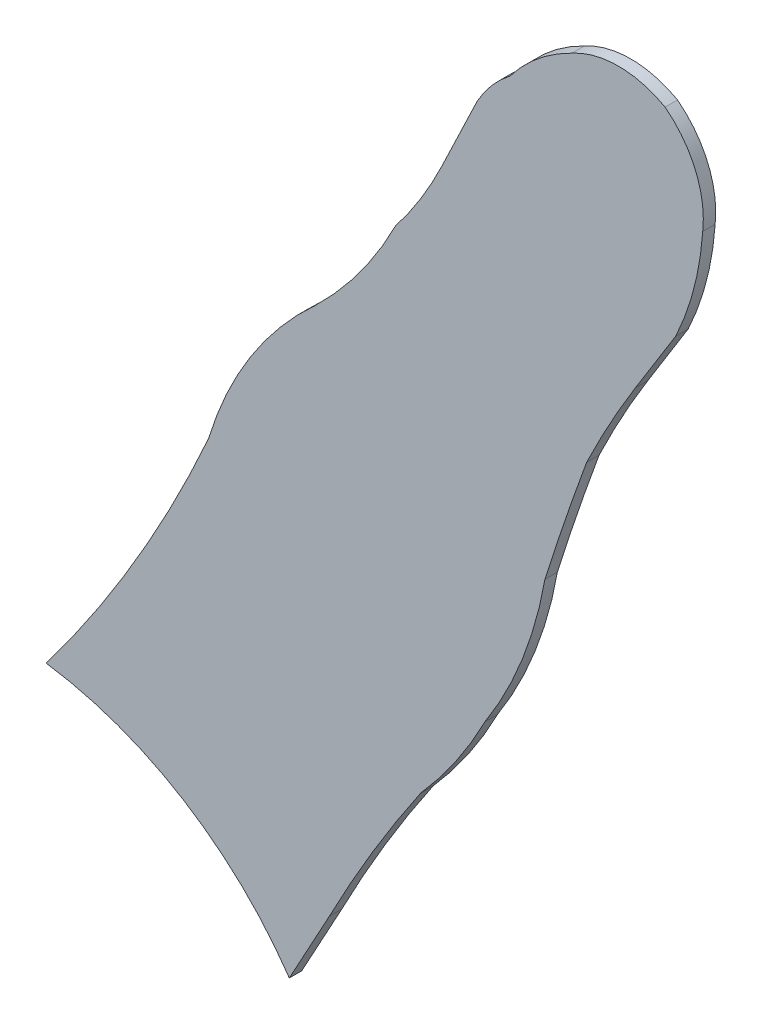
ISO-10303-21;
HEADER;
FILE_DESCRIPTION(('STEP AP214'),'2;1');
FILE_NAME('part.step','',(''),(''),'','','');
FILE_SCHEMA(('AUTOMOTIVE_DESIGN { 1 0 10303 214 1 1 1 1 }'));
ENDSEC;
DATA;
#1=APPLICATION_CONTEXT('core data for automotive mechanical design processes');
#2=APPLICATION_PROTOCOL_DEFINITION('international standard','automotive_design',2000,#1);
#3=PRODUCT_CONTEXT('',#1,'mechanical');
#4=PRODUCT('Part','Part','',(#3));
#5=PRODUCT_RELATED_PRODUCT_CATEGORY('part','',(#4));
#6=PRODUCT_DEFINITION_FORMATION('','',#4);
#7=PRODUCT_DEFINITION_CONTEXT('part definition',#1,'design');
#8=PRODUCT_DEFINITION('design','',#6,#7);
#9=PRODUCT_DEFINITION_SHAPE('','',#8);
#10=(LENGTH_UNIT() NAMED_UNIT(*) SI_UNIT(.MILLI.,.METRE.));
#11=(NAMED_UNIT(*) PLANE_ANGLE_UNIT() SI_UNIT($,.RADIAN.));
#12=(NAMED_UNIT(*) SI_UNIT($,.STERADIAN.) SOLID_ANGLE_UNIT());
#13=UNCERTAINTY_MEASURE_WITH_UNIT(LENGTH_MEASURE(1.E-05),#10,'distance_accuracy_value','');
#14=(GEOMETRIC_REPRESENTATION_CONTEXT(3) GLOBAL_UNCERTAINTY_ASSIGNED_CONTEXT((#13)) GLOBAL_UNIT_ASSIGNED_CONTEXT((#10,
#11,#12)) REPRESENTATION_CONTEXT('',''));
#15=CARTESIAN_POINT('',(0.,0.,0.));
#16=DIRECTION('',(0.,0.,1.));
#17=DIRECTION('',(1.,0.,0.));
#18=AXIS2_PLACEMENT_3D('',#15,#16,#17);
#19=CARTESIAN_POINT('',(-296.907701734014,215.451639205642,10.));
#20=DIRECTION('',(0.,0.,-1.));
#21=DIRECTION('',(-1.,0.,0.));
#22=AXIS2_PLACEMENT_3D('',#19,#20,#21);
#23=CYLINDRICAL_SURFACE('',#22,285.665619178737);
#24=CARTESIAN_POINT('',(-296.907701734014,215.451639205642,0.));
#25=DIRECTION('',(0.,0.,-1.));
#26=DIRECTION('',(-1.,0.,0.));
#27=AXIS2_PLACEMENT_3D('',#24,#25,#26);
#28=CIRCLE('',#27,285.665619178737);
#29=CARTESIAN_POINT('',(-256.734722377638,498.278401925161,0.));
#30=VERTEX_POINT('',#29);
#31=CARTESIAN_POINT('',(-61.0803163162581,376.666682758645,0.));
#32=VERTEX_POINT('',#31);
#33=EDGE_CURVE('E193',#30,#32,#28,.T.);
#34=ORIENTED_EDGE('',*,*,#33,.T.);
#35=DIRECTION('',(0.,0.,-1.));
#36=VECTOR('',#35,1.);
#37=CARTESIAN_POINT('',(-61.0803163162581,376.666682758645,10.));
#38=LINE('',#37,#36);
#39=CARTESIAN_POINT('',(-61.0803163162581,376.666682758645,10.));
#40=VERTEX_POINT('',#39);
#41=EDGE_CURVE('E11',#40,#32,#38,.T.);
#42=ORIENTED_EDGE('',*,*,#41,.F.);
#43=CARTESIAN_POINT('',(-296.907701734014,215.451639205642,10.));
#44=DIRECTION('',(0.,0.,-1.));
#45=DIRECTION('',(-1.,0.,0.));
#46=AXIS2_PLACEMENT_3D('',#43,#44,#45);
#47=CIRCLE('',#46,285.665619178737);
#48=CARTESIAN_POINT('',(-256.734722377638,498.278401925161,10.));
#49=VERTEX_POINT('',#48);
#50=EDGE_CURVE('E227',#49,#40,#47,.T.);
#51=ORIENTED_EDGE('',*,*,#50,.F.);
#52=DIRECTION('',(0.,0.,-1.));
#53=VECTOR('',#52,1.);
#54=CARTESIAN_POINT('',(-256.734722377638,498.278401925161,10.));
#55=LINE('',#54,#53);
#56=EDGE_CURVE('E189',#49,#30,#55,.T.);
#57=ORIENTED_EDGE('',*,*,#56,.T.);
#58=EDGE_LOOP('',(#34,#42,#51,#57));
#59=FACE_BOUND('',#58,.T.);
#60=ADVANCED_FACE('F37',(#59),#23,.F.);
#61=CARTESIAN_POINT('',(-61.0803163162581,376.666682758645,10.));
#62=DIRECTION('',(-0.878041348053031,0.478584779437475,0.));
#63=DIRECTION('',(-0.478584779437475,-0.878041348053031,0.));
#64=AXIS2_PLACEMENT_3D('',#61,#62,#63);
#65=PLANE('',#64);
#66=DIRECTION('',(0.478584779437475,0.878041348053031,0.));
#67=VECTOR('',#66,1.);
#68=CARTESIAN_POINT('',(-61.0803163162581,376.666682758645,0.));
#69=LINE('',#68,#67);
#70=CARTESIAN_POINT('',(-28.8433056212658,435.81070393103,0.));
#71=VERTEX_POINT('',#70);
#72=EDGE_CURVE('E196',#32,#71,#69,.T.);
#73=ORIENTED_EDGE('',*,*,#72,.T.);
#74=DIRECTION('',(0.,0.,-1.));
#75=VECTOR('',#74,1.);
#76=CARTESIAN_POINT('',(-28.8433056212658,435.81070393103,10.));
#77=LINE('',#76,#75);
#78=CARTESIAN_POINT('',(-28.8433056212658,435.81070393103,10.));
#79=VERTEX_POINT('',#78);
#80=EDGE_CURVE('E45',#79,#71,#77,.T.);
#81=ORIENTED_EDGE('',*,*,#80,.F.);
#82=DIRECTION('',(0.478584779437475,0.878041348053031,0.));
#83=VECTOR('',#82,1.);
#84=CARTESIAN_POINT('',(-61.0803163162581,376.666682758645,10.));
#85=LINE('',#84,#83);
#86=EDGE_CURVE('E126',#40,#79,#85,.T.);
#87=ORIENTED_EDGE('',*,*,#86,.F.);
#88=ORIENTED_EDGE('',*,*,#41,.T.);
#89=EDGE_LOOP('',(#73,#81,#87,#88));
#90=FACE_BOUND('',#89,.T.);
#91=ADVANCED_FACE('F335',(#90),#65,.F.);
#92=CARTESIAN_POINT('',(1024.93949207777,-112.641895156004,10.));
#93=DIRECTION('',(0.,0.,-1.));
#94=DIRECTION('',(-1.,0.,0.));
#95=AXIS2_PLACEMENT_3D('',#92,#93,#94);
#96=CYLINDRICAL_SURFACE('',#95,1187.96398858371);
#97=CARTESIAN_POINT('',(1024.93949207777,-112.641895156004,0.));
#98=DIRECTION('',(0.,0.,-1.));
#99=DIRECTION('',(-1.,0.,0.));
#100=AXIS2_PLACEMENT_3D('',#97,#98,#99);
#101=CIRCLE('',#100,1187.96398858371);
#102=CARTESIAN_POINT('',(44.6754362229467,558.432481475067,0.));
#103=VERTEX_POINT('',#102);
#104=EDGE_CURVE('E198',#71,#103,#101,.T.);
#105=ORIENTED_EDGE('',*,*,#104,.T.);
#106=DIRECTION('',(0.,0.,-1.));
#107=VECTOR('',#106,1.);
#108=CARTESIAN_POINT('',(44.6754362229467,558.432481475067,10.));
#109=LINE('',#108,#107);
#110=CARTESIAN_POINT('',(44.6754362229467,558.432481475067,10.));
#111=VERTEX_POINT('',#110);
#112=EDGE_CURVE('E264',#111,#103,#109,.T.);
#113=ORIENTED_EDGE('',*,*,#112,.F.);
#114=CARTESIAN_POINT('',(1024.93949207777,-112.641895156004,10.));
#115=DIRECTION('',(0.,0.,-1.));
#116=DIRECTION('',(-1.,0.,0.));
#117=AXIS2_PLACEMENT_3D('',#114,#115,#116);
#118=CIRCLE('',#117,1187.96398858371);
#119=EDGE_CURVE('E272',#79,#111,#118,.T.);
#120=ORIENTED_EDGE('',*,*,#119,.F.);
#121=ORIENTED_EDGE('',*,*,#80,.T.);
#122=EDGE_LOOP('',(#105,#113,#120,#121));
#123=FACE_BOUND('',#122,.T.);
#124=ADVANCED_FACE('F270',(#123),#96,.F.);
#125=CARTESIAN_POINT('',(-231.175080599273,802.756554740704,10.));
#126=DIRECTION('',(0.,0.,-1.));
#127=DIRECTION('',(-1.,0.,0.));
#128=AXIS2_PLACEMENT_3D('',#125,#126,#127);
#129=CYLINDRICAL_SURFACE('',#128,368.493908237569);
#130=CARTESIAN_POINT('',(-231.175080599273,802.756554740704,0.));
#131=DIRECTION('',(0.,0.,1.));
#132=DIRECTION('',(1.,0.,0.));
#133=AXIS2_PLACEMENT_3D('',#130,#131,#132);
#134=CIRCLE('',#133,368.493908237569);
#135=CARTESIAN_POINT('',(96.3980385642676,633.985668597191,0.));
#136=VERTEX_POINT('',#135);
#137=EDGE_CURVE('E200',#103,#136,#134,.T.);
#138=ORIENTED_EDGE('',*,*,#137,.T.);
#139=DIRECTION('',(0.,0.,-1.));
#140=VECTOR('',#139,1.);
#141=CARTESIAN_POINT('',(96.3980385642676,633.985668597191,10.));
#142=LINE('',#141,#140);
#143=CARTESIAN_POINT('',(96.3980385642676,633.985668597191,10.));
#144=VERTEX_POINT('',#143);
#145=EDGE_CURVE('E261',#144,#136,#142,.T.);
#146=ORIENTED_EDGE('',*,*,#145,.F.);
#147=CARTESIAN_POINT('',(-231.175080599273,802.756554740704,10.));
#148=DIRECTION('',(0.,0.,1.));
#149=DIRECTION('',(1.,0.,0.));
#150=AXIS2_PLACEMENT_3D('',#147,#148,#149);
#151=CIRCLE('',#150,368.493908237569);
#152=EDGE_CURVE('E290',#111,#144,#151,.T.);
#153=ORIENTED_EDGE('',*,*,#152,.F.);
#154=ORIENTED_EDGE('',*,*,#112,.T.);
#155=EDGE_LOOP('',(#138,#146,#153,#154));
#156=FACE_BOUND('',#155,.T.);
#157=ADVANCED_FACE('F281',(#156),#129,.T.);
#158=CARTESIAN_POINT('',(-184.553110950266,815.04365849185,10.));
#159=DIRECTION('',(0.,0.,-1.));
#160=DIRECTION('',(-1.,0.,0.));
#161=AXIS2_PLACEMENT_3D('',#158,#159,#160);
#162=CYLINDRICAL_SURFACE('',#161,334.238753166404);
#163=CARTESIAN_POINT('',(-184.553110950266,815.04365849185,0.));
#164=DIRECTION('',(0.,0.,1.));
#165=DIRECTION('',(1.,0.,0.));
#166=AXIS2_PLACEMENT_3D('',#163,#164,#165);
#167=CIRCLE('',#166,334.238753166404);
#168=CARTESIAN_POINT('',(144.678077695769,757.403667678603,0.));
#169=VERTEX_POINT('',#168);
#170=EDGE_CURVE('E202',#136,#169,#167,.T.);
#171=ORIENTED_EDGE('',*,*,#170,.T.);
#172=DIRECTION('',(0.,0.,-1.));
#173=VECTOR('',#172,1.);
#174=CARTESIAN_POINT('',(144.678077695769,757.403667678603,10.));
#175=LINE('',#174,#173);
#176=CARTESIAN_POINT('',(144.678077695769,757.403667678603,10.));
#177=VERTEX_POINT('',#176);
#178=EDGE_CURVE('E258',#177,#169,#175,.T.);
#179=ORIENTED_EDGE('',*,*,#178,.F.);
#180=CARTESIAN_POINT('',(-184.553110950266,815.04365849185,10.));
#181=DIRECTION('',(0.,0.,1.));
#182=DIRECTION('',(1.,0.,0.));
#183=AXIS2_PLACEMENT_3D('',#180,#181,#182);
#184=CIRCLE('',#183,334.238753166404);
#185=EDGE_CURVE('E287',#144,#177,#184,.T.);
#186=ORIENTED_EDGE('',*,*,#185,.F.);
#187=ORIENTED_EDGE('',*,*,#145,.T.);
#188=EDGE_LOOP('',(#171,#179,#186,#187));
#189=FACE_BOUND('',#188,.T.);
#190=ADVANCED_FACE('F285',(#189),#162,.T.);
#191=CARTESIAN_POINT('',(2226.35627289631,102.071243348814,10.));
#192=DIRECTION('',(0.,0.,-1.));
#193=DIRECTION('',(-1.,0.,0.));
#194=AXIS2_PLACEMENT_3D('',#191,#192,#193);
#195=CYLINDRICAL_SURFACE('',#194,2182.39425740432);
#196=CARTESIAN_POINT('',(2226.35627289631,102.071243348814,0.));
#197=DIRECTION('',(0.,0.,-1.));
#198=DIRECTION('',(-1.,0.,0.));
#199=AXIS2_PLACEMENT_3D('',#196,#197,#198);
#200=CIRCLE('',#199,2182.39425740432);
#201=CARTESIAN_POINT('',(178.225545137063,855.732451558253,0.));
#202=VERTEX_POINT('',#201);
#203=EDGE_CURVE('E204',#169,#202,#200,.T.);
#204=ORIENTED_EDGE('',*,*,#203,.T.);
#205=DIRECTION('',(0.,0.,-1.));
#206=VECTOR('',#205,1.);
#207=CARTESIAN_POINT('',(178.225545137063,855.732451558253,10.));
#208=LINE('',#207,#206);
#209=CARTESIAN_POINT('',(178.225545137063,855.732451558253,10.));
#210=VERTEX_POINT('',#209);
#211=EDGE_CURVE('E255',#210,#202,#208,.T.);
#212=ORIENTED_EDGE('',*,*,#211,.F.);
#213=CARTESIAN_POINT('',(2226.35627289631,102.071243348814,10.));
#214=DIRECTION('',(0.,0.,-1.));
#215=DIRECTION('',(-1.,0.,0.));
#216=AXIS2_PLACEMENT_3D('',#213,#214,#215);
#217=CIRCLE('',#216,2182.39425740432);
#218=EDGE_CURVE('E289',#177,#210,#217,.T.);
#219=ORIENTED_EDGE('',*,*,#218,.F.);
#220=ORIENTED_EDGE('',*,*,#178,.T.);
#221=EDGE_LOOP('',(#204,#212,#219,#220));
#222=FACE_BOUND('',#221,.T.);
#223=ADVANCED_FACE('F348',(#222),#195,.F.);
#224=CARTESIAN_POINT('',(854.992963874388,531.247464755268,10.));
#225=DIRECTION('',(0.,0.,-1.));
#226=DIRECTION('',(-1.,0.,0.));
#227=AXIS2_PLACEMENT_3D('',#224,#225,#226);
#228=CYLINDRICAL_SURFACE('',#227,750.536238781923);
#229=CARTESIAN_POINT('',(854.992963874388,531.247464755268,0.));
#230=DIRECTION('',(0.,0.,-1.));
#231=DIRECTION('',(-1.,0.,0.));
#232=AXIS2_PLACEMENT_3D('',#229,#230,#231);
#233=CIRCLE('',#232,750.536238781923);
#234=CARTESIAN_POINT('',(217.557058688926,927.454623329298,0.));
#235=VERTEX_POINT('',#234);
#236=EDGE_CURVE('E206',#202,#235,#233,.T.);
#237=ORIENTED_EDGE('',*,*,#236,.T.);
#238=DIRECTION('',(0.,0.,-1.));
#239=VECTOR('',#238,1.);
#240=CARTESIAN_POINT('',(217.557058688926,927.454623329298,10.));
#241=LINE('',#240,#239);
#242=CARTESIAN_POINT('',(217.557058688926,927.454623329298,10.));
#243=VERTEX_POINT('',#242);
#244=EDGE_CURVE('E252',#243,#235,#241,.T.);
#245=ORIENTED_EDGE('',*,*,#244,.F.);
#246=CARTESIAN_POINT('',(854.992963874388,531.247464755268,10.));
#247=DIRECTION('',(0.,0.,-1.));
#248=DIRECTION('',(-1.,0.,0.));
#249=AXIS2_PLACEMENT_3D('',#246,#247,#248);
#250=CIRCLE('',#249,750.536238781923);
#251=EDGE_CURVE('E292',#210,#243,#250,.T.);
#252=ORIENTED_EDGE('',*,*,#251,.F.);
#253=ORIENTED_EDGE('',*,*,#211,.T.);
#254=EDGE_LOOP('',(#237,#245,#252,#253));
#255=FACE_BOUND('',#254,.T.);
#256=ADVANCED_FACE('F351',(#255),#228,.F.);
#257=CARTESIAN_POINT('',(217.557058688926,927.454623329298,10.));
#258=DIRECTION('',(-0.84930729823251,0.527898771706276,0.));
#259=DIRECTION('',(-0.527898771706276,-0.84930729823251,0.));
#260=AXIS2_PLACEMENT_3D('',#257,#258,#259);
#261=PLANE('',#260);
#262=DIRECTION('',(0.527898771706276,0.84930729823251,0.));
#263=VECTOR('',#262,1.);
#264=CARTESIAN_POINT('',(217.557058688926,927.454623329298,0.));
#265=LINE('',#264,#263);
#266=CARTESIAN_POINT('',(249.993176002528,979.639308419067,0.));
#267=VERTEX_POINT('',#266);
#268=EDGE_CURVE('E208',#235,#267,#265,.T.);
#269=ORIENTED_EDGE('',*,*,#268,.T.);
#270=DIRECTION('',(0.,0.,-1.));
#271=VECTOR('',#270,1.);
#272=CARTESIAN_POINT('',(249.993176002528,979.639308419067,10.));
#273=LINE('',#272,#271);
#274=CARTESIAN_POINT('',(249.993176002528,979.639308419067,10.));
#275=VERTEX_POINT('',#274);
#276=EDGE_CURVE('E249',#275,#267,#273,.T.);
#277=ORIENTED_EDGE('',*,*,#276,.F.);
#278=DIRECTION('',(0.527898771706276,0.84930729823251,0.));
#279=VECTOR('',#278,1.);
#280=CARTESIAN_POINT('',(217.557058688926,927.454623329298,10.));
#281=LINE('',#280,#279);
#282=EDGE_CURVE('E298',#243,#275,#281,.T.);
#283=ORIENTED_EDGE('',*,*,#282,.F.);
#284=ORIENTED_EDGE('',*,*,#244,.T.);
#285=EDGE_LOOP('',(#269,#277,#283,#284));
#286=FACE_BOUND('',#285,.T.);
#287=ADVANCED_FACE('F355',(#286),#261,.F.);
#288=CARTESIAN_POINT('',(37.1928698674763,1079.52155619547,10.));
#289=DIRECTION('',(0.,0.,-1.));
#290=DIRECTION('',(-1.,0.,0.));
#291=AXIS2_PLACEMENT_3D('',#288,#289,#290);
#292=CYLINDRICAL_SURFACE('',#291,235.075378787399);
#293=CARTESIAN_POINT('',(37.1928698674763,1079.52155619547,0.));
#294=DIRECTION('',(0.,0.,1.));
#295=DIRECTION('',(1.,0.,0.));
#296=AXIS2_PLACEMENT_3D('',#293,#294,#295);
#297=CIRCLE('',#296,235.075378787399);
#298=CARTESIAN_POINT('',(271.717774960986,1063.44354005791,0.));
#299=VERTEX_POINT('',#298);
#300=EDGE_CURVE('E210',#267,#299,#297,.T.);
#301=ORIENTED_EDGE('',*,*,#300,.T.);
#302=DIRECTION('',(0.,0.,-1.));
#303=VECTOR('',#302,1.);
#304=CARTESIAN_POINT('',(271.717774960986,1063.44354005791,10.));
#305=LINE('',#304,#303);
#306=CARTESIAN_POINT('',(271.717774960986,1063.44354005791,10.));
#307=VERTEX_POINT('',#306);
#308=EDGE_CURVE('E246',#307,#299,#305,.T.);
#309=ORIENTED_EDGE('',*,*,#308,.F.);
#310=CARTESIAN_POINT('',(37.1928698674763,1079.52155619547,10.));
#311=DIRECTION('',(0.,0.,1.));
#312=DIRECTION('',(1.,0.,0.));
#313=AXIS2_PLACEMENT_3D('',#310,#311,#312);
#314=CIRCLE('',#313,235.075378787399);
#315=EDGE_CURVE('E300',#275,#307,#314,.T.);
#316=ORIENTED_EDGE('',*,*,#315,.F.);
#317=ORIENTED_EDGE('',*,*,#276,.T.);
#318=EDGE_LOOP('',(#301,#309,#316,#317));
#319=FACE_BOUND('',#318,.T.);
#320=ADVANCED_FACE('F359',(#319),#292,.T.);
#321=CARTESIAN_POINT('',(192.672877848879,1072.24849057561,10.));
#322=DIRECTION('',(0.,0.,-1.));
#323=DIRECTION('',(-1.,0.,0.));
#324=AXIS2_PLACEMENT_3D('',#321,#322,#323);
#325=CYLINDRICAL_SURFACE('',#324,79.5337847275145);
#326=CARTESIAN_POINT('',(192.672877848879,1072.24849057561,0.));
#327=DIRECTION('',(0.,0.,1.));
#328=DIRECTION('',(1.,0.,0.));
#329=AXIS2_PLACEMENT_3D('',#326,#327,#328);
#330=CIRCLE('',#329,79.5337847275145);
#331=CARTESIAN_POINT('',(241.454957205053,1135.06514160677,0.));
#332=VERTEX_POINT('',#331);
#333=EDGE_CURVE('E212',#299,#332,#330,.T.);
#334=ORIENTED_EDGE('',*,*,#333,.T.);
#335=DIRECTION('',(0.,0.,-1.));
#336=VECTOR('',#335,1.);
#337=CARTESIAN_POINT('',(241.454957205053,1135.06514160677,10.));
#338=LINE('',#337,#336);
#339=CARTESIAN_POINT('',(241.454957205053,1135.06514160677,10.));
#340=VERTEX_POINT('',#339);
#341=EDGE_CURVE('E243',#340,#332,#338,.T.);
#342=ORIENTED_EDGE('',*,*,#341,.F.);
#343=CARTESIAN_POINT('',(192.672877848879,1072.24849057561,10.));
#344=DIRECTION('',(0.,0.,1.));
#345=DIRECTION('',(1.,0.,0.));
#346=AXIS2_PLACEMENT_3D('',#343,#344,#345);
#347=CIRCLE('',#346,79.5337847275145);
#348=EDGE_CURVE('E302',#307,#340,#347,.T.);
#349=ORIENTED_EDGE('',*,*,#348,.F.);
#350=ORIENTED_EDGE('',*,*,#308,.T.);
#351=EDGE_LOOP('',(#334,#342,#349,#350));
#352=FACE_BOUND('',#351,.T.);
#353=ADVANCED_FACE('F363',(#352),#325,.T.);
#354=CARTESIAN_POINT('',(203.849887915657,1068.00916346063,10.));
#355=DIRECTION('',(0.,0.,-1.));
#356=DIRECTION('',(-1.,0.,0.));
#357=AXIS2_PLACEMENT_3D('',#354,#355,#356);
#358=CYLINDRICAL_SURFACE('',#357,76.8807221700995);
#359=CARTESIAN_POINT('',(203.849887915657,1068.00916346063,0.));
#360=DIRECTION('',(0.,0.,1.));
#361=DIRECTION('',(1.,0.,0.));
#362=AXIS2_PLACEMENT_3D('',#359,#360,#361);
#363=CIRCLE('',#362,76.8807221700995);
#364=CARTESIAN_POINT('',(166.244818626262,1135.06514160677,0.));
#365=VERTEX_POINT('',#364);
#366=EDGE_CURVE('E214',#332,#365,#363,.T.);
#367=ORIENTED_EDGE('',*,*,#366,.T.);
#368=DIRECTION('',(0.,0.,-1.));
#369=VECTOR('',#368,1.);
#370=CARTESIAN_POINT('',(166.244818626262,1135.06514160677,10.));
#371=LINE('',#370,#369);
#372=CARTESIAN_POINT('',(166.244818626262,1135.06514160677,10.));
#373=VERTEX_POINT('',#372);
#374=EDGE_CURVE('E240',#373,#365,#371,.T.);
#375=ORIENTED_EDGE('',*,*,#374,.F.);
#376=CARTESIAN_POINT('',(203.849887915657,1068.00916346063,10.));
#377=DIRECTION('',(0.,0.,1.));
#378=DIRECTION('',(1.,0.,0.));
#379=AXIS2_PLACEMENT_3D('',#376,#377,#378);
#380=CIRCLE('',#379,76.8807221700995);
#381=EDGE_CURVE('E304',#340,#373,#380,.T.);
#382=ORIENTED_EDGE('',*,*,#381,.F.);
#383=ORIENTED_EDGE('',*,*,#341,.T.);
#384=EDGE_LOOP('',(#367,#375,#382,#383));
#385=FACE_BOUND('',#384,.T.);
#386=ADVANCED_FACE('F367',(#385),#358,.T.);
#387=CARTESIAN_POINT('',(226.031143929889,1011.67703889592,10.));
#388=DIRECTION('',(0.,0.,-1.));
#389=DIRECTION('',(-1.,0.,0.));
#390=AXIS2_PLACEMENT_3D('',#387,#388,#389);
#391=CYLINDRICAL_SURFACE('',#390,137.109549572215);
#392=CARTESIAN_POINT('',(226.031143929889,1011.67703889592,0.));
#393=DIRECTION('',(0.,0.,1.));
#394=DIRECTION('',(1.,0.,0.));
#395=AXIS2_PLACEMENT_3D('',#392,#393,#394);
#396=CIRCLE('',#395,137.109549572215);
#397=CARTESIAN_POINT('',(116.685466785633,1094.39675525036,0.));
#398=VERTEX_POINT('',#397);
#399=EDGE_CURVE('E216',#365,#398,#396,.T.);
#400=ORIENTED_EDGE('',*,*,#399,.T.);
#401=DIRECTION('',(0.,0.,-1.));
#402=VECTOR('',#401,1.);
#403=CARTESIAN_POINT('',(116.685466785633,1094.39675525036,10.));
#404=LINE('',#403,#402);
#405=CARTESIAN_POINT('',(116.685466785633,1094.39675525036,10.));
#406=VERTEX_POINT('',#405);
#407=EDGE_CURVE('E237',#406,#398,#404,.T.);
#408=ORIENTED_EDGE('',*,*,#407,.F.);
#409=CARTESIAN_POINT('',(226.031143929889,1011.67703889592,10.));
#410=DIRECTION('',(0.,0.,1.));
#411=DIRECTION('',(1.,0.,0.));
#412=AXIS2_PLACEMENT_3D('',#409,#410,#411);
#413=CIRCLE('',#412,137.109549572215);
#414=EDGE_CURVE('E306',#373,#406,#413,.T.);
#415=ORIENTED_EDGE('',*,*,#414,.F.);
#416=ORIENTED_EDGE('',*,*,#374,.T.);
#417=EDGE_LOOP('',(#400,#408,#415,#416));
#418=FACE_BOUND('',#417,.T.);
#419=ADVANCED_FACE('F371',(#418),#391,.T.);
#420=CARTESIAN_POINT('',(177.60050086333,1015.24473515769,10.));
#421=DIRECTION('',(0.,0.,-1.));
#422=DIRECTION('',(-1.,0.,0.));
#423=AXIS2_PLACEMENT_3D('',#420,#421,#422);
#424=CYLINDRICAL_SURFACE('',#423,99.8783443066493);
#425=CARTESIAN_POINT('',(177.60050086333,1015.24473515769,0.));
#426=DIRECTION('',(0.,0.,1.));
#427=DIRECTION('',(-1.,0.,0.));
#428=AXIS2_PLACEMENT_3D('',#425,#426,#427);
#429=CIRCLE('',#428,99.8783443066493);
#430=CARTESIAN_POINT('',(90.1215955910988,1063.44354005791,0.));
#431=VERTEX_POINT('',#430);
#432=EDGE_CURVE('E218',#398,#431,#429,.T.);
#433=ORIENTED_EDGE('',*,*,#432,.T.);
#434=DIRECTION('',(0.,0.,-1.));
#435=VECTOR('',#434,1.);
#436=CARTESIAN_POINT('',(90.1215955910988,1063.44354005791,10.));
#437=LINE('',#436,#435);
#438=CARTESIAN_POINT('',(90.1215955910988,1063.44354005791,10.));
#439=VERTEX_POINT('',#438);
#440=EDGE_CURVE('E234',#439,#431,#437,.T.);
#441=ORIENTED_EDGE('',*,*,#440,.F.);
#442=CARTESIAN_POINT('',(177.60050086333,1015.24473515769,10.));
#443=DIRECTION('',(0.,0.,1.));
#444=DIRECTION('',(-1.,0.,0.));
#445=AXIS2_PLACEMENT_3D('',#442,#443,#444);
#446=CIRCLE('',#445,99.8783443066493);
#447=EDGE_CURVE('E308',#406,#439,#446,.T.);
#448=ORIENTED_EDGE('',*,*,#447,.F.);
#449=ORIENTED_EDGE('',*,*,#407,.T.);
#450=EDGE_LOOP('',(#433,#441,#448,#449));
#451=FACE_BOUND('',#450,.T.);
#452=ADVANCED_FACE('F375',(#451),#424,.T.);
#453=CARTESIAN_POINT('',(61.7196730813027,1004.04013852194,10.));
#454=DIRECTION('',(0.902183871272108,-0.431351669078111,0.));
#455=DIRECTION('',(0.431351669078111,0.902183871272108,0.));
#456=AXIS2_PLACEMENT_3D('',#453,#454,#455);
#457=PLANE('',#456);
#458=DIRECTION('',(-0.431351669078111,-0.902183871272108,0.));
#459=VECTOR('',#458,1.);
#460=CARTESIAN_POINT('',(61.7196730813027,1004.04013852194,0.));
#461=LINE('',#460,#459);
#462=CARTESIAN_POINT('',(61.7196730813026,1004.04013852194,0.));
#463=VERTEX_POINT('',#462);
#464=EDGE_CURVE('E220',#431,#463,#461,.T.);
#465=ORIENTED_EDGE('',*,*,#464,.T.);
#466=DIRECTION('',(0.,0.,-1.));
#467=VECTOR('',#466,1.);
#468=CARTESIAN_POINT('',(61.7196730813026,1004.04013852194,10.));
#469=LINE('',#468,#467);
#470=CARTESIAN_POINT('',(61.7196730813026,1004.04013852194,10.));
#471=VERTEX_POINT('',#470);
#472=EDGE_CURVE('E231',#471,#463,#469,.T.);
#473=ORIENTED_EDGE('',*,*,#472,.F.);
#474=DIRECTION('',(-0.431351669078111,-0.902183871272108,0.));
#475=VECTOR('',#474,1.);
#476=CARTESIAN_POINT('',(61.7196730813027,1004.04013852194,10.));
#477=LINE('',#476,#475);
#478=EDGE_CURVE('E310',#439,#471,#477,.T.);
#479=ORIENTED_EDGE('',*,*,#478,.F.);
#480=ORIENTED_EDGE('',*,*,#440,.T.);
#481=EDGE_LOOP('',(#465,#473,#479,#480));
#482=FACE_BOUND('',#481,.T.);
#483=ADVANCED_FACE('F316',(#482),#457,.F.);
#484=CARTESIAN_POINT('',(-235.706014109212,1146.24514869956,10.));
#485=DIRECTION('',(0.,0.,-1.));
#486=DIRECTION('',(-1.,0.,0.));
#487=AXIS2_PLACEMENT_3D('',#484,#485,#486);
#488=CYLINDRICAL_SURFACE('',#487,329.673026376691);
#489=CARTESIAN_POINT('',(-235.706014109212,1146.24514869956,0.));
#490=DIRECTION('',(0.,0.,-1.));
#491=DIRECTION('',(1.,0.,0.));
#492=AXIS2_PLACEMENT_3D('',#489,#490,#491);
#493=CIRCLE('',#492,329.673026376691);
#494=CARTESIAN_POINT('',(24.3699185959581,943.649952438884,0.));
#495=VERTEX_POINT('',#494);
#496=EDGE_CURVE('E222',#463,#495,#493,.T.);
#497=ORIENTED_EDGE('',*,*,#496,.T.);
#498=DIRECTION('',(0.,0.,-1.));
#499=VECTOR('',#498,1.);
#500=CARTESIAN_POINT('',(24.3699185959581,943.649952438884,10.));
#501=LINE('',#500,#499);
#502=CARTESIAN_POINT('',(24.3699185959581,943.649952438884,10.));
#503=VERTEX_POINT('',#502);
#504=EDGE_CURVE('E184',#503,#495,#501,.T.);
#505=ORIENTED_EDGE('',*,*,#504,.F.);
#506=CARTESIAN_POINT('',(-235.706014109212,1146.24514869956,10.));
#507=DIRECTION('',(0.,0.,-1.));
#508=DIRECTION('',(1.,0.,0.));
#509=AXIS2_PLACEMENT_3D('',#506,#507,#508);
#510=CIRCLE('',#509,329.673026376691);
#511=EDGE_CURVE('E175',#471,#503,#510,.T.);
#512=ORIENTED_EDGE('',*,*,#511,.F.);
#513=ORIENTED_EDGE('',*,*,#472,.T.);
#514=EDGE_LOOP('',(#497,#505,#512,#513));
#515=FACE_BOUND('',#514,.T.);
#516=ADVANCED_FACE('F320',(#515),#488,.F.);
#517=CARTESIAN_POINT('',(-268.633331519498,1091.72153286951,10.));
#518=DIRECTION('',(0.,0.,-1.));
#519=DIRECTION('',(-1.,0.,0.));
#520=AXIS2_PLACEMENT_3D('',#517,#518,#519);
#521=CYLINDRICAL_SURFACE('',#520,328.292700968881);
#522=CARTESIAN_POINT('',(-268.633331519498,1091.72153286951,0.));
#523=DIRECTION('',(0.,0.,-1.));
#524=DIRECTION('',(1.,0.,0.));
#525=AXIS2_PLACEMENT_3D('',#522,#523,#524);
#526=CIRCLE('',#525,328.292700968881);
#527=CARTESIAN_POINT('',(-40.4113978424014,855.732451558253,0.));
#528=VERTEX_POINT('',#527);
#529=EDGE_CURVE('E183',#495,#528,#526,.T.);
#530=ORIENTED_EDGE('',*,*,#529,.T.);
#531=DIRECTION('',(0.,0.,-1.));
#532=VECTOR('',#531,1.);
#533=CARTESIAN_POINT('',(-40.4113978424014,855.732451558253,10.));
#534=LINE('',#533,#532);
#535=CARTESIAN_POINT('',(-40.4113978424014,855.732451558253,10.));
#536=VERTEX_POINT('',#535);
#537=EDGE_CURVE('E180',#536,#528,#534,.T.);
#538=ORIENTED_EDGE('',*,*,#537,.F.);
#539=CARTESIAN_POINT('',(-268.633331519498,1091.72153286951,10.));
#540=DIRECTION('',(0.,0.,-1.));
#541=DIRECTION('',(1.,0.,0.));
#542=AXIS2_PLACEMENT_3D('',#539,#540,#541);
#543=CIRCLE('',#542,328.292700968881);
#544=EDGE_CURVE('E169',#503,#536,#543,.T.);
#545=ORIENTED_EDGE('',*,*,#544,.F.);
#546=ORIENTED_EDGE('',*,*,#504,.T.);
#547=EDGE_LOOP('',(#530,#538,#545,#546));
#548=FACE_BOUND('',#547,.T.);
#549=ADVANCED_FACE('F181',(#548),#521,.F.);
#550=CARTESIAN_POINT('',(160.389267502748,633.985668597191,10.));
#551=DIRECTION('',(0.,0.,-1.));
#552=DIRECTION('',(-1.,0.,0.));
#553=AXIS2_PLACEMENT_3D('',#550,#551,#552);
#554=CYLINDRICAL_SURFACE('',#553,299.153042699946);
#555=CARTESIAN_POINT('',(160.389267502748,633.985668597191,0.));
#556=DIRECTION('',(0.,0.,1.));
#557=DIRECTION('',(-1.,0.,0.));
#558=AXIS2_PLACEMENT_3D('',#555,#556,#557);
#559=CIRCLE('',#558,299.153042699946);
#560=CARTESIAN_POINT('',(-126.015280278806,720.385772570966,0.));
#561=VERTEX_POINT('',#560);
#562=EDGE_CURVE('E112',#528,#561,#559,.T.);
#563=ORIENTED_EDGE('',*,*,#562,.T.);
#564=DIRECTION('',(0.,0.,-1.));
#565=VECTOR('',#564,1.);
#566=CARTESIAN_POINT('',(-126.015280278806,720.385772570966,10.));
#567=LINE('',#566,#565);
#568=CARTESIAN_POINT('',(-126.015280278806,720.385772570966,10.));
#569=VERTEX_POINT('',#568);
#570=EDGE_CURVE('E185',#569,#561,#567,.T.);
#571=ORIENTED_EDGE('',*,*,#570,.F.);
#572=CARTESIAN_POINT('',(160.389267502748,633.985668597191,10.));
#573=DIRECTION('',(0.,0.,1.));
#574=DIRECTION('',(-1.,0.,0.));
#575=AXIS2_PLACEMENT_3D('',#572,#573,#574);
#576=CIRCLE('',#575,299.153042699946);
#577=EDGE_CURVE('E173',#536,#569,#576,.T.);
#578=ORIENTED_EDGE('',*,*,#577,.F.);
#579=ORIENTED_EDGE('',*,*,#537,.T.);
#580=EDGE_LOOP('',(#563,#571,#578,#579));
#581=FACE_BOUND('',#580,.T.);
#582=ADVANCED_FACE('F187',(#581),#554,.T.);
#583=CARTESIAN_POINT('',(-1159.67905884592,1179.21937109962,10.));
#584=DIRECTION('',(0.,0.,-1.));
#585=DIRECTION('',(-1.,0.,0.));
#586=AXIS2_PLACEMENT_3D('',#583,#584,#585);
#587=CYLINDRICAL_SURFACE('',#586,1130.9239931403);
#588=CARTESIAN_POINT('',(-1159.67905884592,1179.21937109962,0.));
#589=DIRECTION('',(0.,0.,-1.));
#590=DIRECTION('',(1.,0.,0.));
#591=AXIS2_PLACEMENT_3D('',#588,#589,#590);
#592=CIRCLE('',#591,1130.9239931403);
#593=EDGE_CURVE('E118',#561,#30,#592,.T.);
#594=ORIENTED_EDGE('',*,*,#593,.T.);
#595=ORIENTED_EDGE('',*,*,#56,.F.);
#596=CARTESIAN_POINT('',(-1159.67905884592,1179.21937109962,10.));
#597=DIRECTION('',(0.,0.,-1.));
#598=DIRECTION('',(1.,0.,0.));
#599=AXIS2_PLACEMENT_3D('',#596,#597,#598);
#600=CIRCLE('',#599,1130.9239931403);
#601=EDGE_CURVE('E53',#569,#49,#600,.T.);
#602=ORIENTED_EDGE('',*,*,#601,.F.);
#603=ORIENTED_EDGE('',*,*,#570,.T.);
#604=EDGE_LOOP('',(#594,#595,#602,#603));
#605=FACE_BOUND('',#604,.T.);
#606=ADVANCED_FACE('F324',(#605),#587,.F.);
#607=CARTESIAN_POINT('',(-296.907701734014,215.451639205642,10.));
#608=DIRECTION('',(0.,0.,-1.));
#609=DIRECTION('',(-1.,0.,0.));
#610=AXIS2_PLACEMENT_3D('',#607,#608,#609);
#611=PLANE('',#610);
#612=ORIENTED_EDGE('',*,*,#50,.T.);
#613=ORIENTED_EDGE('',*,*,#86,.T.);
#614=ORIENTED_EDGE('',*,*,#119,.T.);
#615=ORIENTED_EDGE('',*,*,#152,.T.);
#616=ORIENTED_EDGE('',*,*,#185,.T.);
#617=ORIENTED_EDGE('',*,*,#218,.T.);
#618=ORIENTED_EDGE('',*,*,#251,.T.);
#619=ORIENTED_EDGE('',*,*,#282,.T.);
#620=ORIENTED_EDGE('',*,*,#315,.T.);
#621=ORIENTED_EDGE('',*,*,#348,.T.);
#622=ORIENTED_EDGE('',*,*,#381,.T.);
#623=ORIENTED_EDGE('',*,*,#414,.T.);
#624=ORIENTED_EDGE('',*,*,#447,.T.);
#625=ORIENTED_EDGE('',*,*,#478,.T.);
#626=ORIENTED_EDGE('',*,*,#511,.T.);
#627=ORIENTED_EDGE('',*,*,#544,.T.);
#628=ORIENTED_EDGE('',*,*,#577,.T.);
#629=ORIENTED_EDGE('',*,*,#601,.T.);
#630=EDGE_LOOP('',(#612,#613,#614,#615,#616,#617,#618,#619,#620,#621,#622,#623,#624,#625,#626,
#627,#628,#629));
#631=FACE_BOUND('',#630,.T.);
#632=ADVANCED_FACE('F171',(#631),#611,.F.);
#633=CARTESIAN_POINT('',(-296.907701734014,215.451639205642,0.));
#634=DIRECTION('',(0.,0.,-1.));
#635=DIRECTION('',(-1.,0.,0.));
#636=AXIS2_PLACEMENT_3D('',#633,#634,#635);
#637=PLANE('',#636);
#638=ORIENTED_EDGE('',*,*,#33,.F.);
#639=ORIENTED_EDGE('',*,*,#593,.F.);
#640=ORIENTED_EDGE('',*,*,#562,.F.);
#641=ORIENTED_EDGE('',*,*,#529,.F.);
#642=ORIENTED_EDGE('',*,*,#496,.F.);
#643=ORIENTED_EDGE('',*,*,#464,.F.);
#644=ORIENTED_EDGE('',*,*,#432,.F.);
#645=ORIENTED_EDGE('',*,*,#399,.F.);
#646=ORIENTED_EDGE('',*,*,#366,.F.);
#647=ORIENTED_EDGE('',*,*,#333,.F.);
#648=ORIENTED_EDGE('',*,*,#300,.F.);
#649=ORIENTED_EDGE('',*,*,#268,.F.);
#650=ORIENTED_EDGE('',*,*,#236,.F.);
#651=ORIENTED_EDGE('',*,*,#203,.F.);
#652=ORIENTED_EDGE('',*,*,#170,.F.);
#653=ORIENTED_EDGE('',*,*,#137,.F.);
#654=ORIENTED_EDGE('',*,*,#104,.F.);
#655=ORIENTED_EDGE('',*,*,#72,.F.);
#656=EDGE_LOOP('',(#638,#639,#640,#641,#642,#643,#644,#645,#646,#647,#648,#649,#650,#651,#652,
#653,#654,#655));
#657=FACE_BOUND('',#656,.T.);
#658=ADVANCED_FACE('F276',(#657),#637,.T.);
#659=CLOSED_SHELL('',(#60,#91,#124,#157,#190,#223,#256,#287,#320,#353,#386,#419,#452,#483,#516,
#549,#582,#606,#632,#658));
#660=MANIFOLD_SOLID_BREP('B2',#659);
#661=ADVANCED_BREP_SHAPE_REPRESENTATION('',(#18,#660),#14);
#662=SHAPE_DEFINITION_REPRESENTATION(#9,#661);
ENDSEC;
END-ISO-10303-21;
